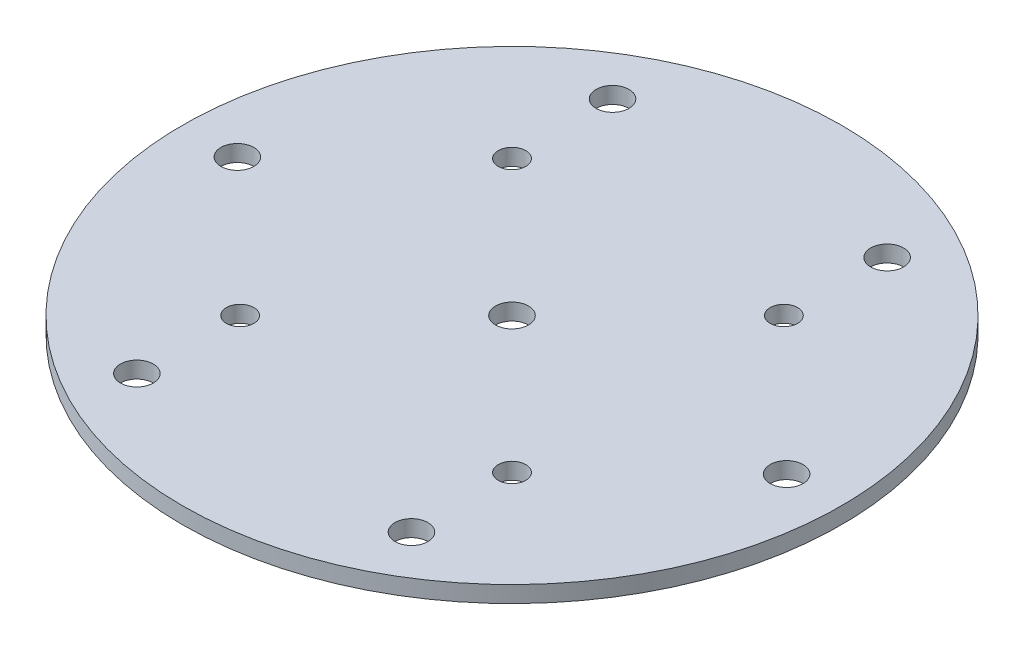
ISO-10303-21;
HEADER;
FILE_DESCRIPTION(('STEP AP214'),'2;1');
FILE_NAME('part.step','',(''),(''),'','','');
FILE_SCHEMA(('AUTOMOTIVE_DESIGN { 1 0 10303 214 1 1 1 1 }'));
ENDSEC;
DATA;
#1=APPLICATION_CONTEXT('core data for automotive mechanical design processes');
#2=APPLICATION_PROTOCOL_DEFINITION('international standard','automotive_design',2000,#1);
#3=PRODUCT_CONTEXT('',#1,'mechanical');
#4=PRODUCT('Part','Part','',(#3));
#5=PRODUCT_RELATED_PRODUCT_CATEGORY('part','',(#4));
#6=PRODUCT_DEFINITION_FORMATION('','',#4);
#7=PRODUCT_DEFINITION_CONTEXT('part definition',#1,'design');
#8=PRODUCT_DEFINITION('design','',#6,#7);
#9=PRODUCT_DEFINITION_SHAPE('','',#8);
#10=(LENGTH_UNIT() NAMED_UNIT(*) SI_UNIT(.MILLI.,.METRE.));
#11=(NAMED_UNIT(*) PLANE_ANGLE_UNIT() SI_UNIT($,.RADIAN.));
#12=(NAMED_UNIT(*) SI_UNIT($,.STERADIAN.) SOLID_ANGLE_UNIT());
#13=UNCERTAINTY_MEASURE_WITH_UNIT(LENGTH_MEASURE(1.E-05),#10,'distance_accuracy_value','');
#14=(GEOMETRIC_REPRESENTATION_CONTEXT(3) GLOBAL_UNCERTAINTY_ASSIGNED_CONTEXT((#13)) GLOBAL_UNIT_ASSIGNED_CONTEXT((#10,
#11,#12)) REPRESENTATION_CONTEXT('',''));
#15=CARTESIAN_POINT('',(0.,0.,0.));
#16=DIRECTION('',(0.,0.,1.));
#17=DIRECTION('',(1.,0.,0.));
#18=AXIS2_PLACEMENT_3D('',#15,#16,#17);
#19=CARTESIAN_POINT('',(-50.,3.,0.));
#20=DIRECTION('',(0.,-1.,0.));
#21=DIRECTION('',(0.,0.,-1.));
#22=AXIS2_PLACEMENT_3D('',#19,#20,#21);
#23=CYLINDRICAL_SURFACE('',#22,3.);
#24=CARTESIAN_POINT('',(-50.,3.,0.));
#25=DIRECTION('',(0.,1.,0.));
#26=DIRECTION('',(0.,0.,1.));
#27=AXIS2_PLACEMENT_3D('',#24,#25,#26);
#28=CIRCLE('',#27,3.);
#29=CARTESIAN_POINT('',(-50.,3.,3.));
#30=VERTEX_POINT('',#29);
#31=EDGE_CURVE('E54',#30,#30,#28,.T.);
#32=ORIENTED_EDGE('',*,*,#31,.T.);
#33=EDGE_LOOP('',(#32));
#34=FACE_BOUND('',#33,.T.);
#35=CARTESIAN_POINT('',(-50.,0.,0.));
#36=DIRECTION('',(0.,1.,0.));
#37=DIRECTION('',(0.,0.,1.));
#38=AXIS2_PLACEMENT_3D('',#35,#36,#37);
#39=CIRCLE('',#38,3.);
#40=CARTESIAN_POINT('',(-50.,0.,3.));
#41=VERTEX_POINT('',#40);
#42=EDGE_CURVE('E100',#41,#41,#39,.T.);
#43=ORIENTED_EDGE('',*,*,#42,.F.);
#44=EDGE_LOOP('',(#43));
#45=FACE_BOUND('',#44,.T.);
#46=ADVANCED_FACE('F45',(#34,#45),#23,.F.);
#47=CARTESIAN_POINT('',(-24.9999999999999,3.,-43.301270189222));
#48=DIRECTION('',(0.,-1.,0.));
#49=DIRECTION('',(0.,0.,-1.));
#50=AXIS2_PLACEMENT_3D('',#47,#48,#49);
#51=CYLINDRICAL_SURFACE('',#50,3.);
#52=CARTESIAN_POINT('',(-24.9999999999999,3.,-43.301270189222));
#53=DIRECTION('',(0.,1.,0.));
#54=DIRECTION('',(0.,0.,1.));
#55=AXIS2_PLACEMENT_3D('',#52,#53,#54);
#56=CIRCLE('',#55,3.);
#57=CARTESIAN_POINT('',(-24.9999999999999,3.,-40.301270189222));
#58=VERTEX_POINT('',#57);
#59=EDGE_CURVE('E60',#58,#58,#56,.T.);
#60=ORIENTED_EDGE('',*,*,#59,.T.);
#61=EDGE_LOOP('',(#60));
#62=FACE_BOUND('',#61,.T.);
#63=CARTESIAN_POINT('',(-24.9999999999999,0.,-43.301270189222));
#64=DIRECTION('',(0.,1.,0.));
#65=DIRECTION('',(0.,0.,1.));
#66=AXIS2_PLACEMENT_3D('',#63,#64,#65);
#67=CIRCLE('',#66,3.);
#68=CARTESIAN_POINT('',(-24.9999999999999,0.,-40.301270189222));
#69=VERTEX_POINT('',#68);
#70=EDGE_CURVE('E97',#69,#69,#67,.T.);
#71=ORIENTED_EDGE('',*,*,#70,.F.);
#72=EDGE_LOOP('',(#71));
#73=FACE_BOUND('',#72,.T.);
#74=ADVANCED_FACE('F150',(#62,#73),#51,.F.);
#75=CARTESIAN_POINT('',(25.0000000000002,3.,-43.3012701892218));
#76=DIRECTION('',(0.,-1.,0.));
#77=DIRECTION('',(0.,0.,-1.));
#78=AXIS2_PLACEMENT_3D('',#75,#76,#77);
#79=CYLINDRICAL_SURFACE('',#78,3.);
#80=CARTESIAN_POINT('',(25.0000000000002,3.,-43.3012701892218));
#81=DIRECTION('',(0.,1.,0.));
#82=DIRECTION('',(0.,0.,1.));
#83=AXIS2_PLACEMENT_3D('',#80,#81,#82);
#84=CIRCLE('',#83,3.);
#85=CARTESIAN_POINT('',(25.0000000000002,3.,-40.3012701892218));
#86=VERTEX_POINT('',#85);
#87=EDGE_CURVE('E143',#86,#86,#84,.T.);
#88=ORIENTED_EDGE('',*,*,#87,.T.);
#89=EDGE_LOOP('',(#88));
#90=FACE_BOUND('',#89,.T.);
#91=CARTESIAN_POINT('',(25.0000000000002,0.,-43.3012701892218));
#92=DIRECTION('',(0.,1.,0.));
#93=DIRECTION('',(0.,0.,1.));
#94=AXIS2_PLACEMENT_3D('',#91,#92,#93);
#95=CIRCLE('',#94,3.);
#96=CARTESIAN_POINT('',(25.0000000000002,0.,-40.3012701892218));
#97=VERTEX_POINT('',#96);
#98=EDGE_CURVE('E93',#97,#97,#95,.T.);
#99=ORIENTED_EDGE('',*,*,#98,.F.);
#100=EDGE_LOOP('',(#99));
#101=FACE_BOUND('',#100,.T.);
#102=ADVANCED_FACE('F168',(#90,#101),#79,.F.);
#103=CARTESIAN_POINT('',(50.,3.,3.49148133884313E-13));
#104=DIRECTION('',(0.,-1.,0.));
#105=DIRECTION('',(0.,0.,-1.));
#106=AXIS2_PLACEMENT_3D('',#103,#104,#105);
#107=CYLINDRICAL_SURFACE('',#106,3.);
#108=CARTESIAN_POINT('',(50.,3.,3.49148133884313E-13));
#109=DIRECTION('',(0.,1.,0.));
#110=DIRECTION('',(0.,0.,1.));
#111=AXIS2_PLACEMENT_3D('',#108,#109,#110);
#112=CIRCLE('',#111,3.);
#113=CARTESIAN_POINT('',(50.,3.,3.00000000000035));
#114=VERTEX_POINT('',#113);
#115=EDGE_CURVE('E139',#114,#114,#112,.T.);
#116=ORIENTED_EDGE('',*,*,#115,.T.);
#117=EDGE_LOOP('',(#116));
#118=FACE_BOUND('',#117,.T.);
#119=CARTESIAN_POINT('',(50.,0.,3.49148133884313E-13));
#120=DIRECTION('',(0.,1.,0.));
#121=DIRECTION('',(0.,0.,1.));
#122=AXIS2_PLACEMENT_3D('',#119,#120,#121);
#123=CIRCLE('',#122,3.);
#124=CARTESIAN_POINT('',(50.,0.,3.00000000000035));
#125=VERTEX_POINT('',#124);
#126=EDGE_CURVE('E89',#125,#125,#123,.T.);
#127=ORIENTED_EDGE('',*,*,#126,.F.);
#128=EDGE_LOOP('',(#127));
#129=FACE_BOUND('',#128,.T.);
#130=ADVANCED_FACE('F175',(#118,#129),#107,.F.);
#131=CARTESIAN_POINT('',(24.9999999999996,3.,43.3012701892222));
#132=DIRECTION('',(0.,-1.,0.));
#133=DIRECTION('',(0.,0.,-1.));
#134=AXIS2_PLACEMENT_3D('',#131,#132,#133);
#135=CYLINDRICAL_SURFACE('',#134,3.);
#136=CARTESIAN_POINT('',(24.9999999999996,3.,43.3012701892222));
#137=DIRECTION('',(0.,1.,0.));
#138=DIRECTION('',(0.,0.,1.));
#139=AXIS2_PLACEMENT_3D('',#136,#137,#138);
#140=CIRCLE('',#139,3.);
#141=CARTESIAN_POINT('',(24.9999999999996,3.,46.3012701892222));
#142=VERTEX_POINT('',#141);
#143=EDGE_CURVE('E135',#142,#142,#140,.T.);
#144=ORIENTED_EDGE('',*,*,#143,.T.);
#145=EDGE_LOOP('',(#144));
#146=FACE_BOUND('',#145,.T.);
#147=CARTESIAN_POINT('',(24.9999999999996,0.,43.3012701892222));
#148=DIRECTION('',(0.,1.,0.));
#149=DIRECTION('',(0.,0.,1.));
#150=AXIS2_PLACEMENT_3D('',#147,#148,#149);
#151=CIRCLE('',#150,3.);
#152=CARTESIAN_POINT('',(24.9999999999996,0.,46.3012701892222));
#153=VERTEX_POINT('',#152);
#154=EDGE_CURVE('E85',#153,#153,#151,.T.);
#155=ORIENTED_EDGE('',*,*,#154,.F.);
#156=EDGE_LOOP('',(#155));
#157=FACE_BOUND('',#156,.T.);
#158=ADVANCED_FACE('F179',(#146,#157),#135,.F.);
#159=CARTESIAN_POINT('',(-25.0000000000005,3.,43.3012701892216));
#160=DIRECTION('',(0.,-1.,0.));
#161=DIRECTION('',(0.,0.,-1.));
#162=AXIS2_PLACEMENT_3D('',#159,#160,#161);
#163=CYLINDRICAL_SURFACE('',#162,3.);
#164=CARTESIAN_POINT('',(-25.0000000000005,3.,43.3012701892216));
#165=DIRECTION('',(0.,1.,0.));
#166=DIRECTION('',(0.,0.,1.));
#167=AXIS2_PLACEMENT_3D('',#164,#165,#166);
#168=CIRCLE('',#167,3.);
#169=CARTESIAN_POINT('',(-25.0000000000005,3.,46.3012701892216));
#170=VERTEX_POINT('',#169);
#171=EDGE_CURVE('E131',#170,#170,#168,.T.);
#172=ORIENTED_EDGE('',*,*,#171,.T.);
#173=EDGE_LOOP('',(#172));
#174=FACE_BOUND('',#173,.T.);
#175=CARTESIAN_POINT('',(-25.0000000000005,0.,43.3012701892216));
#176=DIRECTION('',(0.,1.,0.));
#177=DIRECTION('',(0.,0.,1.));
#178=AXIS2_PLACEMENT_3D('',#175,#176,#177);
#179=CIRCLE('',#178,3.);
#180=CARTESIAN_POINT('',(-25.0000000000005,0.,46.3012701892216));
#181=VERTEX_POINT('',#180);
#182=EDGE_CURVE('E81',#181,#181,#179,.T.);
#183=ORIENTED_EDGE('',*,*,#182,.F.);
#184=EDGE_LOOP('',(#183));
#185=FACE_BOUND('',#184,.T.);
#186=ADVANCED_FACE('F183',(#174,#185),#163,.F.);
#187=CARTESIAN_POINT('',(-24.748737341529,3.,-24.7487373415293));
#188=DIRECTION('',(0.,-1.,0.));
#189=DIRECTION('',(0.,0.,-1.));
#190=AXIS2_PLACEMENT_3D('',#187,#188,#189);
#191=CYLINDRICAL_SURFACE('',#190,2.5);
#192=CARTESIAN_POINT('',(-24.748737341529,3.,-24.7487373415293));
#193=DIRECTION('',(0.,1.,0.));
#194=DIRECTION('',(0.,0.,1.));
#195=AXIS2_PLACEMENT_3D('',#192,#193,#194);
#196=CIRCLE('',#195,2.5);
#197=CARTESIAN_POINT('',(-24.748737341529,3.,-22.2487373415293));
#198=VERTEX_POINT('',#197);
#199=EDGE_CURVE('E127',#198,#198,#196,.T.);
#200=ORIENTED_EDGE('',*,*,#199,.T.);
#201=EDGE_LOOP('',(#200));
#202=FACE_BOUND('',#201,.T.);
#203=CARTESIAN_POINT('',(-24.748737341529,0.,-24.7487373415293));
#204=DIRECTION('',(0.,1.,0.));
#205=DIRECTION('',(0.,0.,1.));
#206=AXIS2_PLACEMENT_3D('',#203,#204,#205);
#207=CIRCLE('',#206,2.5);
#208=CARTESIAN_POINT('',(-24.748737341529,0.,-22.2487373415293));
#209=VERTEX_POINT('',#208);
#210=EDGE_CURVE('E77',#209,#209,#207,.T.);
#211=ORIENTED_EDGE('',*,*,#210,.F.);
#212=EDGE_LOOP('',(#211));
#213=FACE_BOUND('',#212,.T.);
#214=ADVANCED_FACE('F187',(#202,#213),#191,.F.);
#215=CARTESIAN_POINT('',(24.7487373415293,3.,-24.7487373415304));
#216=DIRECTION('',(0.,-1.,0.));
#217=DIRECTION('',(0.,0.,-1.));
#218=AXIS2_PLACEMENT_3D('',#215,#216,#217);
#219=CYLINDRICAL_SURFACE('',#218,2.5);
#220=CARTESIAN_POINT('',(24.7487373415293,3.,-24.7487373415304));
#221=DIRECTION('',(0.,1.,0.));
#222=DIRECTION('',(0.,0.,1.));
#223=AXIS2_PLACEMENT_3D('',#220,#221,#222);
#224=CIRCLE('',#223,2.5);
#225=CARTESIAN_POINT('',(24.7487373415293,3.,-22.2487373415304));
#226=VERTEX_POINT('',#225);
#227=EDGE_CURVE('E118',#226,#226,#224,.T.);
#228=ORIENTED_EDGE('',*,*,#227,.T.);
#229=EDGE_LOOP('',(#228));
#230=FACE_BOUND('',#229,.T.);
#231=CARTESIAN_POINT('',(24.7487373415293,0.,-24.7487373415304));
#232=DIRECTION('',(0.,1.,0.));
#233=DIRECTION('',(0.,0.,1.));
#234=AXIS2_PLACEMENT_3D('',#231,#232,#233);
#235=CIRCLE('',#234,2.5);
#236=CARTESIAN_POINT('',(24.7487373415293,0.,-22.2487373415304));
#237=VERTEX_POINT('',#236);
#238=EDGE_CURVE('E73',#237,#237,#235,.T.);
#239=ORIENTED_EDGE('',*,*,#238,.F.);
#240=EDGE_LOOP('',(#239));
#241=FACE_BOUND('',#240,.T.);
#242=ADVANCED_FACE('F191',(#230,#241),#219,.F.);
#243=CARTESIAN_POINT('',(24.7487373415304,3.,24.748737341528));
#244=DIRECTION('',(0.,-1.,0.));
#245=DIRECTION('',(0.,0.,-1.));
#246=AXIS2_PLACEMENT_3D('',#243,#244,#245);
#247=CYLINDRICAL_SURFACE('',#246,2.5);
#248=CARTESIAN_POINT('',(24.7487373415304,3.,24.748737341528));
#249=DIRECTION('',(0.,1.,0.));
#250=DIRECTION('',(0.,0.,1.));
#251=AXIS2_PLACEMENT_3D('',#248,#249,#250);
#252=CIRCLE('',#251,2.5);
#253=CARTESIAN_POINT('',(24.7487373415304,3.,27.2487373415279));
#254=VERTEX_POINT('',#253);
#255=EDGE_CURVE('E112',#254,#254,#252,.T.);
#256=ORIENTED_EDGE('',*,*,#255,.T.);
#257=EDGE_LOOP('',(#256));
#258=FACE_BOUND('',#257,.T.);
#259=CARTESIAN_POINT('',(24.7487373415304,0.,24.748737341528));
#260=DIRECTION('',(0.,1.,0.));
#261=DIRECTION('',(0.,0.,1.));
#262=AXIS2_PLACEMENT_3D('',#259,#260,#261);
#263=CIRCLE('',#262,2.5);
#264=CARTESIAN_POINT('',(24.7487373415304,0.,27.2487373415279));
#265=VERTEX_POINT('',#264);
#266=EDGE_CURVE('E68',#265,#265,#263,.T.);
#267=ORIENTED_EDGE('',*,*,#266,.F.);
#268=EDGE_LOOP('',(#267));
#269=FACE_BOUND('',#268,.T.);
#270=ADVANCED_FACE('F194',(#258,#269),#247,.F.);
#271=CARTESIAN_POINT('',(-24.7487373415279,3.,24.7487373415291));
#272=DIRECTION('',(0.,-1.,0.));
#273=DIRECTION('',(0.,0.,-1.));
#274=AXIS2_PLACEMENT_3D('',#271,#272,#273);
#275=CYLINDRICAL_SURFACE('',#274,2.5);
#276=CARTESIAN_POINT('',(-24.7487373415279,3.,24.7487373415291));
#277=DIRECTION('',(0.,1.,0.));
#278=DIRECTION('',(0.,0.,1.));
#279=AXIS2_PLACEMENT_3D('',#276,#277,#278);
#280=CIRCLE('',#279,2.5);
#281=CARTESIAN_POINT('',(-24.7487373415279,3.,27.2487373415291));
#282=VERTEX_POINT('',#281);
#283=EDGE_CURVE('E107',#282,#282,#280,.T.);
#284=ORIENTED_EDGE('',*,*,#283,.T.);
#285=EDGE_LOOP('',(#284));
#286=FACE_BOUND('',#285,.T.);
#287=CARTESIAN_POINT('',(-24.7487373415279,0.,24.7487373415291));
#288=DIRECTION('',(0.,1.,0.));
#289=DIRECTION('',(0.,0.,1.));
#290=AXIS2_PLACEMENT_3D('',#287,#288,#289);
#291=CIRCLE('',#290,2.5);
#292=CARTESIAN_POINT('',(-24.7487373415279,0.,27.2487373415291));
#293=VERTEX_POINT('',#292);
#294=EDGE_CURVE('E64',#293,#293,#291,.T.);
#295=ORIENTED_EDGE('',*,*,#294,.F.);
#296=EDGE_LOOP('',(#295));
#297=FACE_BOUND('',#296,.T.);
#298=ADVANCED_FACE('F47',(#286,#297),#275,.F.);
#299=CARTESIAN_POINT('',(0.,3.,0.));
#300=DIRECTION('',(0.,-1.,0.));
#301=DIRECTION('',(0.,0.,-1.));
#302=AXIS2_PLACEMENT_3D('',#299,#300,#301);
#303=CYLINDRICAL_SURFACE('',#302,60.);
#304=CARTESIAN_POINT('',(0.,3.,0.));
#305=DIRECTION('',(0.,1.,0.));
#306=DIRECTION('',(0.,0.,1.));
#307=AXIS2_PLACEMENT_3D('',#304,#305,#306);
#308=CIRCLE('',#307,60.);
#309=CARTESIAN_POINT('',(0.,3.,60.));
#310=VERTEX_POINT('',#309);
#311=EDGE_CURVE('E10',#310,#310,#308,.T.);
#312=ORIENTED_EDGE('',*,*,#311,.F.);
#313=EDGE_LOOP('',(#312));
#314=FACE_BOUND('',#313,.T.);
#315=CARTESIAN_POINT('',(0.,0.,0.));
#316=DIRECTION('',(0.,1.,0.));
#317=DIRECTION('',(0.,0.,1.));
#318=AXIS2_PLACEMENT_3D('',#315,#316,#317);
#319=CIRCLE('',#318,60.);
#320=CARTESIAN_POINT('',(0.,0.,60.));
#321=VERTEX_POINT('',#320);
#322=EDGE_CURVE('E49',#321,#321,#319,.T.);
#323=ORIENTED_EDGE('',*,*,#322,.T.);
#324=EDGE_LOOP('',(#323));
#325=FACE_BOUND('',#324,.T.);
#326=ADVANCED_FACE('F157',(#314,#325),#303,.T.);
#327=CARTESIAN_POINT('',(0.,3.,0.));
#328=DIRECTION('',(0.,1.,0.));
#329=DIRECTION('',(0.,0.,1.));
#330=AXIS2_PLACEMENT_3D('',#327,#328,#329);
#331=PLANE('',#330);
#332=CARTESIAN_POINT('',(0.,3.,0.));
#333=DIRECTION('',(0.,1.,0.));
#334=DIRECTION('',(0.,0.,1.));
#335=AXIS2_PLACEMENT_3D('',#332,#333,#334);
#336=CIRCLE('',#335,3.);
#337=CARTESIAN_POINT('',(0.,3.,3.));
#338=VERTEX_POINT('',#337);
#339=EDGE_CURVE('E121',#338,#338,#336,.T.);
#340=ORIENTED_EDGE('',*,*,#339,.F.);
#341=EDGE_LOOP('',(#340));
#342=FACE_BOUND('',#341,.T.);
#343=ORIENTED_EDGE('',*,*,#283,.F.);
#344=EDGE_LOOP('',(#343));
#345=FACE_BOUND('',#344,.T.);
#346=ORIENTED_EDGE('',*,*,#255,.F.);
#347=EDGE_LOOP('',(#346));
#348=FACE_BOUND('',#347,.T.);
#349=ORIENTED_EDGE('',*,*,#227,.F.);
#350=EDGE_LOOP('',(#349));
#351=FACE_BOUND('',#350,.T.);
#352=ORIENTED_EDGE('',*,*,#199,.F.);
#353=EDGE_LOOP('',(#352));
#354=FACE_BOUND('',#353,.T.);
#355=ORIENTED_EDGE('',*,*,#171,.F.);
#356=EDGE_LOOP('',(#355));
#357=FACE_BOUND('',#356,.T.);
#358=ORIENTED_EDGE('',*,*,#143,.F.);
#359=EDGE_LOOP('',(#358));
#360=FACE_BOUND('',#359,.T.);
#361=ORIENTED_EDGE('',*,*,#115,.F.);
#362=EDGE_LOOP('',(#361));
#363=FACE_BOUND('',#362,.T.);
#364=ORIENTED_EDGE('',*,*,#87,.F.);
#365=EDGE_LOOP('',(#364));
#366=FACE_BOUND('',#365,.T.);
#367=ORIENTED_EDGE('',*,*,#59,.F.);
#368=EDGE_LOOP('',(#367));
#369=FACE_BOUND('',#368,.T.);
#370=ORIENTED_EDGE('',*,*,#31,.F.);
#371=EDGE_LOOP('',(#370));
#372=FACE_BOUND('',#371,.T.);
#373=ORIENTED_EDGE('',*,*,#311,.T.);
#374=EDGE_LOOP('',(#373));
#375=FACE_BOUND('',#374,.T.);
#376=ADVANCED_FACE('F153',(#342,#345,#348,#351,#354,#357,#360,#363,#366,#369,#372,#375),#331,.T.);
#377=CARTESIAN_POINT('',(0.,0.,0.));
#378=DIRECTION('',(0.,1.,0.));
#379=DIRECTION('',(0.,0.,1.));
#380=AXIS2_PLACEMENT_3D('',#377,#378,#379);
#381=PLANE('',#380);
#382=CARTESIAN_POINT('',(0.,0.,0.));
#383=DIRECTION('',(0.,1.,0.));
#384=DIRECTION('',(0.,0.,1.));
#385=AXIS2_PLACEMENT_3D('',#382,#383,#384);
#386=CIRCLE('',#385,3.);
#387=CARTESIAN_POINT('',(0.,0.,3.));
#388=VERTEX_POINT('',#387);
#389=EDGE_CURVE('E69',#388,#388,#386,.T.);
#390=ORIENTED_EDGE('',*,*,#389,.T.);
#391=EDGE_LOOP('',(#390));
#392=FACE_BOUND('',#391,.T.);
#393=ORIENTED_EDGE('',*,*,#294,.T.);
#394=EDGE_LOOP('',(#393));
#395=FACE_BOUND('',#394,.T.);
#396=ORIENTED_EDGE('',*,*,#266,.T.);
#397=EDGE_LOOP('',(#396));
#398=FACE_BOUND('',#397,.T.);
#399=ORIENTED_EDGE('',*,*,#238,.T.);
#400=EDGE_LOOP('',(#399));
#401=FACE_BOUND('',#400,.T.);
#402=ORIENTED_EDGE('',*,*,#210,.T.);
#403=EDGE_LOOP('',(#402));
#404=FACE_BOUND('',#403,.T.);
#405=ORIENTED_EDGE('',*,*,#182,.T.);
#406=EDGE_LOOP('',(#405));
#407=FACE_BOUND('',#406,.T.);
#408=ORIENTED_EDGE('',*,*,#154,.T.);
#409=EDGE_LOOP('',(#408));
#410=FACE_BOUND('',#409,.T.);
#411=ORIENTED_EDGE('',*,*,#126,.T.);
#412=EDGE_LOOP('',(#411));
#413=FACE_BOUND('',#412,.T.);
#414=ORIENTED_EDGE('',*,*,#98,.T.);
#415=EDGE_LOOP('',(#414));
#416=FACE_BOUND('',#415,.T.);
#417=ORIENTED_EDGE('',*,*,#70,.T.);
#418=EDGE_LOOP('',(#417));
#419=FACE_BOUND('',#418,.T.);
#420=ORIENTED_EDGE('',*,*,#42,.T.);
#421=EDGE_LOOP('',(#420));
#422=FACE_BOUND('',#421,.T.);
#423=ORIENTED_EDGE('',*,*,#322,.F.);
#424=EDGE_LOOP('',(#423));
#425=FACE_BOUND('',#424,.T.);
#426=ADVANCED_FACE('F156',(#392,#395,#398,#401,#404,#407,#410,#413,#416,#419,#422,#425),#381,.F.);
#427=CARTESIAN_POINT('',(0.,0.,0.));
#428=DIRECTION('',(0.,1.,0.));
#429=DIRECTION('',(0.,0.,1.));
#430=AXIS2_PLACEMENT_3D('',#427,#428,#429);
#431=CYLINDRICAL_SURFACE('',#430,3.);
#432=ORIENTED_EDGE('',*,*,#389,.F.);
#433=EDGE_LOOP('',(#432));
#434=FACE_BOUND('',#433,.T.);
#435=ORIENTED_EDGE('',*,*,#339,.T.);
#436=EDGE_LOOP('',(#435));
#437=FACE_BOUND('',#436,.T.);
#438=ADVANCED_FACE('F207',(#434,#437),#431,.F.);
#439=CLOSED_SHELL('',(#46,#74,#102,#130,#158,#186,#214,#242,#270,#298,#326,#376,#426,#438));
#440=MANIFOLD_SOLID_BREP('B2',#439);
#441=ADVANCED_BREP_SHAPE_REPRESENTATION('',(#18,#440),#14);
#442=SHAPE_DEFINITION_REPRESENTATION(#9,#441);
ENDSEC;
END-ISO-10303-21;
